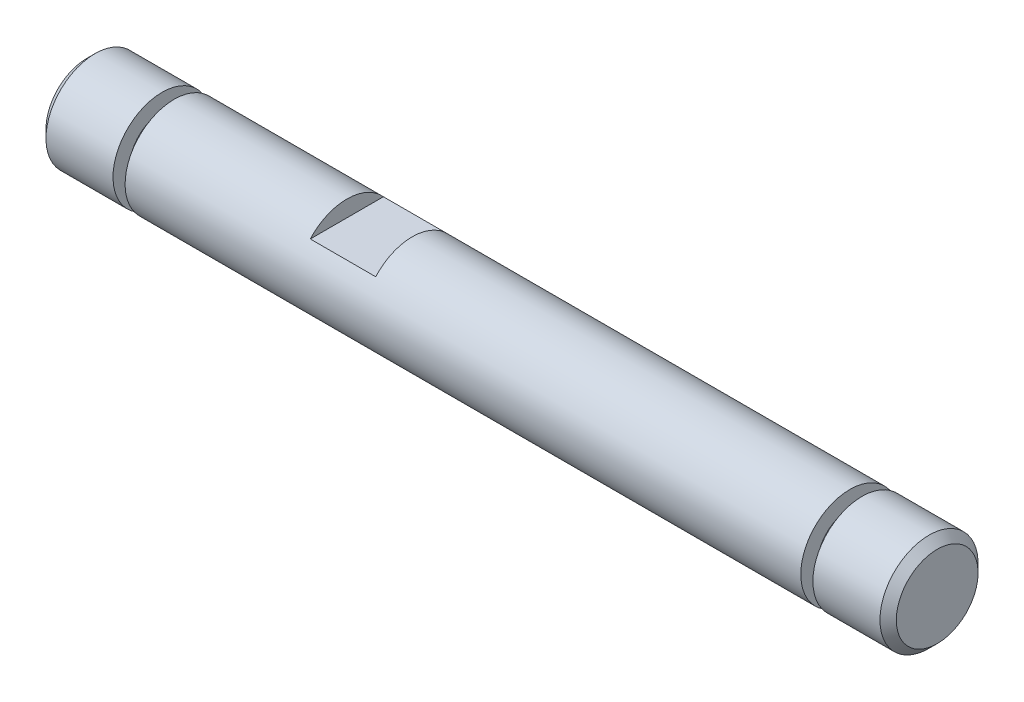
ISO-10303-21;
HEADER;
FILE_DESCRIPTION(('STEP AP214'),'2;1');
FILE_NAME('part.step','',(''),(''),'','','');
FILE_SCHEMA(('AUTOMOTIVE_DESIGN { 1 0 10303 214 1 1 1 1 }'));
ENDSEC;
DATA;
#1=APPLICATION_CONTEXT('core data for automotive mechanical design processes');
#2=APPLICATION_PROTOCOL_DEFINITION('international standard','automotive_design',2000,#1);
#3=PRODUCT_CONTEXT('',#1,'mechanical');
#4=PRODUCT('Part','Part','',(#3));
#5=PRODUCT_RELATED_PRODUCT_CATEGORY('part','',(#4));
#6=PRODUCT_DEFINITION_FORMATION('','',#4);
#7=PRODUCT_DEFINITION_CONTEXT('part definition',#1,'design');
#8=PRODUCT_DEFINITION('design','',#6,#7);
#9=PRODUCT_DEFINITION_SHAPE('','',#8);
#10=(LENGTH_UNIT() NAMED_UNIT(*) SI_UNIT(.MILLI.,.METRE.));
#11=(NAMED_UNIT(*) PLANE_ANGLE_UNIT() SI_UNIT($,.RADIAN.));
#12=(NAMED_UNIT(*) SI_UNIT($,.STERADIAN.) SOLID_ANGLE_UNIT());
#13=UNCERTAINTY_MEASURE_WITH_UNIT(LENGTH_MEASURE(1.E-05),#10,'distance_accuracy_value','');
#14=(GEOMETRIC_REPRESENTATION_CONTEXT(3) GLOBAL_UNCERTAINTY_ASSIGNED_CONTEXT((#13)) GLOBAL_UNIT_ASSIGNED_CONTEXT((#10,
#11,#12)) REPRESENTATION_CONTEXT('',''));
#15=CARTESIAN_POINT('',(0.,0.,0.));
#16=DIRECTION('',(0.,0.,1.));
#17=DIRECTION('',(1.,0.,0.));
#18=AXIS2_PLACEMENT_3D('',#15,#16,#17);
#19=CARTESIAN_POINT('',(0.,0.,0.));
#20=DIRECTION('',(-1.,0.,0.));
#21=DIRECTION('',(0.,0.,1.));
#22=AXIS2_PLACEMENT_3D('',#19,#20,#21);
#23=CYLINDRICAL_SURFACE('',#22,3.);
#24=CARTESIAN_POINT('',(20.66,0.,0.));
#25=DIRECTION('',(1.,0.,0.));
#26=DIRECTION('',(0.,1.,0.));
#27=AXIS2_PLACEMENT_3D('',#24,#25,#26);
#28=CIRCLE('',#27,3.);
#29=CARTESIAN_POINT('',(20.66,3.,0.));
#30=VERTEX_POINT('',#29);
#31=EDGE_CURVE('E98',#30,#30,#28,.T.);
#32=ORIENTED_EDGE('',*,*,#31,.F.);
#33=EDGE_LOOP('',(#32));
#34=FACE_BOUND('',#33,.T.);
#35=CARTESIAN_POINT('',(-6.1,0.,0.));
#36=DIRECTION('',(-1.,0.,0.));
#37=DIRECTION('',(0.,-1.,0.));
#38=AXIS2_PLACEMENT_3D('',#35,#36,#37);
#39=CIRCLE('',#38,3.);
#40=CARTESIAN_POINT('',(-6.1,2.00000000000001,2.23606797749978));
#41=VERTEX_POINT('',#40);
#42=CARTESIAN_POINT('',(-6.1,2.00000000000001,-2.23606797749978));
#43=VERTEX_POINT('',#42);
#44=EDGE_CURVE('E65',#41,#43,#39,.T.);
#45=ORIENTED_EDGE('',*,*,#44,.F.);
#46=DIRECTION('',(-1.,0.,0.));
#47=VECTOR('',#46,1.);
#48=CARTESIAN_POINT('',(0.,2.00000000000001,2.23606797749978));
#49=LINE('',#48,#47);
#50=CARTESIAN_POINT('',(-10.1,2.00000000000001,2.23606797749978));
#51=VERTEX_POINT('',#50);
#52=EDGE_CURVE('E11',#41,#51,#49,.T.);
#53=ORIENTED_EDGE('',*,*,#52,.T.);
#54=CARTESIAN_POINT('',(-10.1,0.,0.));
#55=DIRECTION('',(-1.,0.,0.));
#56=DIRECTION('',(0.,0.,1.));
#57=AXIS2_PLACEMENT_3D('',#54,#55,#56);
#58=CIRCLE('',#57,3.);
#59=CARTESIAN_POINT('',(-10.1,2.00000000000001,-2.23606797749978));
#60=VERTEX_POINT('',#59);
#61=EDGE_CURVE('E41',#51,#60,#58,.T.);
#62=ORIENTED_EDGE('',*,*,#61,.T.);
#63=DIRECTION('',(-1.,0.,0.));
#64=VECTOR('',#63,1.);
#65=CARTESIAN_POINT('',(0.,2.00000000000001,-2.23606797749978));
#66=LINE('',#65,#64);
#67=EDGE_CURVE('E70',#60,#43,#66,.F.);
#68=ORIENTED_EDGE('',*,*,#67,.T.);
#69=EDGE_LOOP('',(#45,#53,#62,#68));
#70=FACE_BOUND('',#69,.T.);
#71=CARTESIAN_POINT('',(-20.66,0.,0.));
#72=DIRECTION('',(1.,0.,0.));
#73=DIRECTION('',(0.,1.,0.));
#74=AXIS2_PLACEMENT_3D('',#71,#72,#73);
#75=CIRCLE('',#74,3.);
#76=CARTESIAN_POINT('',(-20.66,3.,0.));
#77=VERTEX_POINT('',#76);
#78=EDGE_CURVE('E92',#77,#77,#75,.T.);
#79=ORIENTED_EDGE('',*,*,#78,.T.);
#80=EDGE_LOOP('',(#79));
#81=FACE_BOUND('',#80,.T.);
#82=ADVANCED_FACE('F33',(#34,#70,#81),#23,.T.);
#83=CARTESIAN_POINT('',(-21.4,0.,0.));
#84=DIRECTION('',(1.,0.,0.));
#85=DIRECTION('',(0.,1.,0.));
#86=AXIS2_PLACEMENT_3D('',#83,#84,#85);
#87=CIRCLE('',#86,3.);
#88=CARTESIAN_POINT('',(-21.4,3.,0.));
#89=VERTEX_POINT('',#88);
#90=EDGE_CURVE('E95',#89,#89,#87,.T.);
#91=ORIENTED_EDGE('',*,*,#90,.F.);
#92=EDGE_LOOP('',(#91));
#93=FACE_BOUND('',#92,.T.);
#94=CARTESIAN_POINT('',(-25.5,0.,0.));
#95=DIRECTION('',(1.,0.,0.));
#96=DIRECTION('',(0.,0.,-1.));
#97=AXIS2_PLACEMENT_3D('',#94,#95,#96);
#98=CIRCLE('',#97,3.);
#99=CARTESIAN_POINT('',(-25.5,0.,-3.));
#100=VERTEX_POINT('',#99);
#101=EDGE_CURVE('E77',#100,#100,#98,.T.);
#102=ORIENTED_EDGE('',*,*,#101,.T.);
#103=EDGE_LOOP('',(#102));
#104=FACE_BOUND('',#103,.T.);
#105=ADVANCED_FACE('F134',(#93,#104),#23,.T.);
#106=CARTESIAN_POINT('',(-26.,0.,0.));
#107=DIRECTION('',(1.,0.,0.));
#108=DIRECTION('',(0.,0.,-1.));
#109=AXIS2_PLACEMENT_3D('',#106,#107,#108);
#110=PLANE('',#109);
#111=CARTESIAN_POINT('',(-26.,0.,0.));
#112=DIRECTION('',(1.,0.,0.));
#113=DIRECTION('',(0.,0.,-1.));
#114=AXIS2_PLACEMENT_3D('',#111,#112,#113);
#115=CIRCLE('',#114,2.49999999999999);
#116=CARTESIAN_POINT('',(-26.,0.,-2.49999999999999));
#117=VERTEX_POINT('',#116);
#118=EDGE_CURVE('E67',#117,#117,#115,.F.);
#119=ORIENTED_EDGE('',*,*,#118,.T.);
#120=EDGE_LOOP('',(#119));
#121=FACE_BOUND('',#120,.T.);
#122=ADVANCED_FACE('F139',(#121),#110,.F.);
#123=CARTESIAN_POINT('',(-26.,0.,0.));
#124=DIRECTION('',(1.,0.,0.));
#125=DIRECTION('',(0.,0.,-1.));
#126=AXIS2_PLACEMENT_3D('',#123,#124,#125);
#127=CONICAL_SURFACE('',#126,2.49999999999999,0.785398163397446);
#128=ORIENTED_EDGE('',*,*,#101,.F.);
#129=EDGE_LOOP('',(#128));
#130=FACE_BOUND('',#129,.T.);
#131=ORIENTED_EDGE('',*,*,#118,.F.);
#132=EDGE_LOOP('',(#131));
#133=FACE_BOUND('',#132,.T.);
#134=ADVANCED_FACE('F170',(#130,#133),#127,.T.);
#135=CARTESIAN_POINT('',(-21.4,3.,0.));
#136=DIRECTION('',(-1.,0.,0.));
#137=DIRECTION('',(0.,-1.,0.));
#138=AXIS2_PLACEMENT_3D('',#135,#136,#137);
#139=PLANE('',#138);
#140=CARTESIAN_POINT('',(-21.4,0.,0.));
#141=DIRECTION('',(1.,0.,0.));
#142=DIRECTION('',(0.,1.,0.));
#143=AXIS2_PLACEMENT_3D('',#140,#141,#142);
#144=CIRCLE('',#143,2.);
#145=CARTESIAN_POINT('',(-21.4,2.,0.));
#146=VERTEX_POINT('',#145);
#147=EDGE_CURVE('E85',#146,#146,#144,.T.);
#148=ORIENTED_EDGE('',*,*,#147,.F.);
#149=EDGE_LOOP('',(#148));
#150=FACE_BOUND('',#149,.T.);
#151=ORIENTED_EDGE('',*,*,#90,.T.);
#152=EDGE_LOOP('',(#151));
#153=FACE_BOUND('',#152,.T.);
#154=ADVANCED_FACE('F166',(#150,#153),#139,.F.);
#155=CARTESIAN_POINT('',(0.,0.,0.));
#156=DIRECTION('',(1.,0.,0.));
#157=DIRECTION('',(0.,1.,0.));
#158=AXIS2_PLACEMENT_3D('',#155,#156,#157);
#159=CYLINDRICAL_SURFACE('',#158,2.);
#160=CARTESIAN_POINT('',(-20.66,0.,0.));
#161=DIRECTION('',(1.,0.,0.));
#162=DIRECTION('',(0.,1.,0.));
#163=AXIS2_PLACEMENT_3D('',#160,#161,#162);
#164=CIRCLE('',#163,2.);
#165=CARTESIAN_POINT('',(-20.66,2.,0.));
#166=VERTEX_POINT('',#165);
#167=EDGE_CURVE('E89',#166,#166,#164,.T.);
#168=ORIENTED_EDGE('',*,*,#167,.F.);
#169=EDGE_LOOP('',(#168));
#170=FACE_BOUND('',#169,.T.);
#171=ORIENTED_EDGE('',*,*,#147,.T.);
#172=EDGE_LOOP('',(#171));
#173=FACE_BOUND('',#172,.T.);
#174=ADVANCED_FACE('F169',(#170,#173),#159,.T.);
#175=CARTESIAN_POINT('',(-20.66,3.,0.));
#176=DIRECTION('',(1.,0.,0.));
#177=DIRECTION('',(0.,1.,0.));
#178=AXIS2_PLACEMENT_3D('',#175,#176,#177);
#179=PLANE('',#178);
#180=ORIENTED_EDGE('',*,*,#78,.F.);
#181=EDGE_LOOP('',(#180));
#182=FACE_BOUND('',#181,.T.);
#183=ORIENTED_EDGE('',*,*,#167,.T.);
#184=EDGE_LOOP('',(#183));
#185=FACE_BOUND('',#184,.T.);
#186=ADVANCED_FACE('F161',(#182,#185),#179,.F.);
#187=CARTESIAN_POINT('',(-10.1,4.00000000000001,-3.));
#188=DIRECTION('',(-1.,0.,0.));
#189=DIRECTION('',(0.,0.,1.));
#190=AXIS2_PLACEMENT_3D('',#187,#188,#189);
#191=PLANE('',#190);
#192=DIRECTION('',(0.,0.,1.));
#193=VECTOR('',#192,1.);
#194=CARTESIAN_POINT('',(-10.1,2.00000000000001,-3.));
#195=LINE('',#194,#193);
#196=EDGE_CURVE('E60',#60,#51,#195,.T.);
#197=ORIENTED_EDGE('',*,*,#196,.F.);
#198=ORIENTED_EDGE('',*,*,#61,.F.);
#199=EDGE_LOOP('',(#197,#198));
#200=FACE_BOUND('',#199,.T.);
#201=ADVANCED_FACE('F158',(#200),#191,.F.);
#202=CARTESIAN_POINT('',(-10.1,2.00000000000001,-3.));
#203=DIRECTION('',(0.,-1.,0.));
#204=DIRECTION('',(0.,0.,-1.));
#205=AXIS2_PLACEMENT_3D('',#202,#203,#204);
#206=PLANE('',#205);
#207=DIRECTION('',(0.,0.,1.));
#208=VECTOR('',#207,1.);
#209=CARTESIAN_POINT('',(-6.1,2.00000000000001,-3.));
#210=LINE('',#209,#208);
#211=EDGE_CURVE('E48',#43,#41,#210,.T.);
#212=ORIENTED_EDGE('',*,*,#211,.F.);
#213=ORIENTED_EDGE('',*,*,#67,.F.);
#214=ORIENTED_EDGE('',*,*,#196,.T.);
#215=ORIENTED_EDGE('',*,*,#52,.F.);
#216=EDGE_LOOP('',(#212,#213,#214,#215));
#217=FACE_BOUND('',#216,.T.);
#218=ADVANCED_FACE('F59',(#217),#206,.F.);
#219=CARTESIAN_POINT('',(-6.1,4.00000000000001,-3.));
#220=DIRECTION('',(-1.,0.,0.));
#221=DIRECTION('',(0.,-1.,0.));
#222=AXIS2_PLACEMENT_3D('',#219,#220,#221);
#223=PLANE('',#222);
#224=ORIENTED_EDGE('',*,*,#44,.T.);
#225=ORIENTED_EDGE('',*,*,#211,.T.);
#226=EDGE_LOOP('',(#224,#225));
#227=FACE_BOUND('',#226,.T.);
#228=ADVANCED_FACE('F64',(#227),#223,.T.);
#229=CARTESIAN_POINT('',(20.66,3.,0.));
#230=DIRECTION('',(-1.,0.,0.));
#231=DIRECTION('',(0.,-1.,0.));
#232=AXIS2_PLACEMENT_3D('',#229,#230,#231);
#233=PLANE('',#232);
#234=CARTESIAN_POINT('',(20.66,0.,0.));
#235=DIRECTION('',(1.,0.,0.));
#236=DIRECTION('',(0.,1.,0.));
#237=AXIS2_PLACEMENT_3D('',#234,#235,#236);
#238=CIRCLE('',#237,1.99999999999999);
#239=CARTESIAN_POINT('',(20.66,2.,0.));
#240=VERTEX_POINT('',#239);
#241=EDGE_CURVE('E101',#240,#240,#238,.T.);
#242=ORIENTED_EDGE('',*,*,#241,.F.);
#243=EDGE_LOOP('',(#242));
#244=FACE_BOUND('',#243,.T.);
#245=ORIENTED_EDGE('',*,*,#31,.T.);
#246=EDGE_LOOP('',(#245));
#247=FACE_BOUND('',#246,.T.);
#248=ADVANCED_FACE('F124',(#244,#247),#233,.F.);
#249=CARTESIAN_POINT('',(0.,0.,0.));
#250=DIRECTION('',(1.,0.,0.));
#251=DIRECTION('',(0.,1.,0.));
#252=AXIS2_PLACEMENT_3D('',#249,#250,#251);
#253=CYLINDRICAL_SURFACE('',#252,1.99999999999999);
#254=CARTESIAN_POINT('',(21.4,0.,0.));
#255=DIRECTION('',(1.,0.,0.));
#256=DIRECTION('',(0.,1.,0.));
#257=AXIS2_PLACEMENT_3D('',#254,#255,#256);
#258=CIRCLE('',#257,1.99999999999999);
#259=CARTESIAN_POINT('',(21.4,2.,0.));
#260=VERTEX_POINT('',#259);
#261=EDGE_CURVE('E104',#260,#260,#258,.T.);
#262=ORIENTED_EDGE('',*,*,#261,.F.);
#263=EDGE_LOOP('',(#262));
#264=FACE_BOUND('',#263,.T.);
#265=ORIENTED_EDGE('',*,*,#241,.T.);
#266=EDGE_LOOP('',(#265));
#267=FACE_BOUND('',#266,.T.);
#268=ADVANCED_FACE('F118',(#264,#267),#253,.T.);
#269=CARTESIAN_POINT('',(21.4,3.,0.));
#270=DIRECTION('',(1.,0.,0.));
#271=DIRECTION('',(0.,1.,0.));
#272=AXIS2_PLACEMENT_3D('',#269,#270,#271);
#273=PLANE('',#272);
#274=CARTESIAN_POINT('',(21.4,0.,0.));
#275=DIRECTION('',(1.,0.,0.));
#276=DIRECTION('',(0.,1.,0.));
#277=AXIS2_PLACEMENT_3D('',#274,#275,#276);
#278=CIRCLE('',#277,3.);
#279=CARTESIAN_POINT('',(21.4,3.,0.));
#280=VERTEX_POINT('',#279);
#281=EDGE_CURVE('E107',#280,#280,#278,.T.);
#282=ORIENTED_EDGE('',*,*,#281,.F.);
#283=EDGE_LOOP('',(#282));
#284=FACE_BOUND('',#283,.T.);
#285=ORIENTED_EDGE('',*,*,#261,.T.);
#286=EDGE_LOOP('',(#285));
#287=FACE_BOUND('',#286,.T.);
#288=ADVANCED_FACE('F114',(#284,#287),#273,.F.);
#289=CARTESIAN_POINT('',(26.,0.,0.));
#290=DIRECTION('',(-1.,0.,0.));
#291=DIRECTION('',(0.,0.,1.));
#292=AXIS2_PLACEMENT_3D('',#289,#290,#291);
#293=PLANE('',#292);
#294=CARTESIAN_POINT('',(26.,0.,0.));
#295=DIRECTION('',(-1.,0.,0.));
#296=DIRECTION('',(0.,0.,1.));
#297=AXIS2_PLACEMENT_3D('',#294,#295,#296);
#298=CIRCLE('',#297,2.50000000000002);
#299=CARTESIAN_POINT('',(26.,0.,2.50000000000002));
#300=VERTEX_POINT('',#299);
#301=EDGE_CURVE('E72',#300,#300,#298,.F.);
#302=ORIENTED_EDGE('',*,*,#301,.T.);
#303=EDGE_LOOP('',(#302));
#304=FACE_BOUND('',#303,.T.);
#305=ADVANCED_FACE('F117',(#304),#293,.F.);
#306=CARTESIAN_POINT('',(25.5,0.,0.));
#307=DIRECTION('',(-1.,0.,0.));
#308=DIRECTION('',(0.,0.,1.));
#309=AXIS2_PLACEMENT_3D('',#306,#307,#308);
#310=CONICAL_SURFACE('',#309,3.,0.785398163397453);
#311=ORIENTED_EDGE('',*,*,#301,.F.);
#312=EDGE_LOOP('',(#311));
#313=FACE_BOUND('',#312,.T.);
#314=CARTESIAN_POINT('',(25.5,0.,0.));
#315=DIRECTION('',(-1.,0.,0.));
#316=DIRECTION('',(0.,0.,1.));
#317=AXIS2_PLACEMENT_3D('',#314,#315,#316);
#318=CIRCLE('',#317,3.);
#319=CARTESIAN_POINT('',(25.5,0.,3.));
#320=VERTEX_POINT('',#319);
#321=EDGE_CURVE('E80',#320,#320,#318,.T.);
#322=ORIENTED_EDGE('',*,*,#321,.F.);
#323=EDGE_LOOP('',(#322));
#324=FACE_BOUND('',#323,.T.);
#325=ADVANCED_FACE('F35',(#313,#324),#310,.T.);
#326=ORIENTED_EDGE('',*,*,#281,.T.);
#327=EDGE_LOOP('',(#326));
#328=FACE_BOUND('',#327,.T.);
#329=ORIENTED_EDGE('',*,*,#321,.T.);
#330=EDGE_LOOP('',(#329));
#331=FACE_BOUND('',#330,.T.);
#332=ADVANCED_FACE('F111',(#328,#331),#23,.T.);
#333=CLOSED_SHELL('',(#82,#105,#122,#134,#154,#174,#186,#201,#218,#228,#248,#268,#288,#305,#325,#332));
#334=MANIFOLD_SOLID_BREP('B2',#333);
#335=ADVANCED_BREP_SHAPE_REPRESENTATION('',(#18,#334),#14);
#336=SHAPE_DEFINITION_REPRESENTATION(#9,#335);
ENDSEC;
END-ISO-10303-21;
